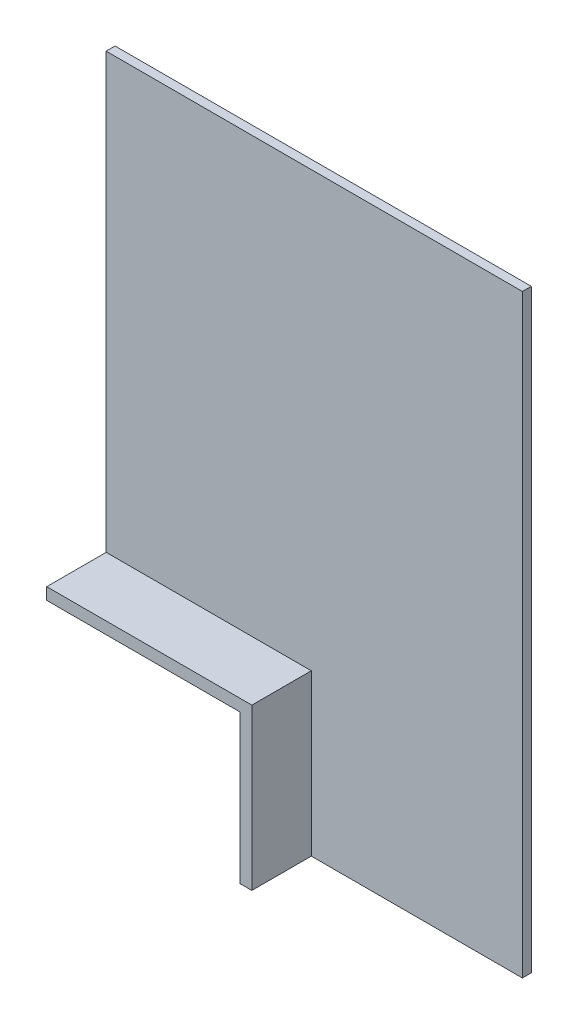
ISO-10303-21;
HEADER;
FILE_DESCRIPTION(('STEP AP214'),'2;1');
FILE_NAME('part.step','',(''),(''),'','','');
FILE_SCHEMA(('AUTOMOTIVE_DESIGN { 1 0 10303 214 1 1 1 1 }'));
ENDSEC;
DATA;
#1=APPLICATION_CONTEXT('core data for automotive mechanical design processes');
#2=APPLICATION_PROTOCOL_DEFINITION('international standard','automotive_design',2000,#1);
#3=PRODUCT_CONTEXT('',#1,'mechanical');
#4=PRODUCT('Part','Part','',(#3));
#5=PRODUCT_RELATED_PRODUCT_CATEGORY('part','',(#4));
#6=PRODUCT_DEFINITION_FORMATION('','',#4);
#7=PRODUCT_DEFINITION_CONTEXT('part definition',#1,'design');
#8=PRODUCT_DEFINITION('design','',#6,#7);
#9=PRODUCT_DEFINITION_SHAPE('','',#8);
#10=(LENGTH_UNIT() NAMED_UNIT(*) SI_UNIT(.MILLI.,.METRE.));
#11=(NAMED_UNIT(*) PLANE_ANGLE_UNIT() SI_UNIT($,.RADIAN.));
#12=(NAMED_UNIT(*) SI_UNIT($,.STERADIAN.) SOLID_ANGLE_UNIT());
#13=UNCERTAINTY_MEASURE_WITH_UNIT(LENGTH_MEASURE(1.E-05),#10,'distance_accuracy_value','');
#14=(GEOMETRIC_REPRESENTATION_CONTEXT(3) GLOBAL_UNCERTAINTY_ASSIGNED_CONTEXT((#13)) GLOBAL_UNIT_ASSIGNED_CONTEXT((#10,
#11,#12)) REPRESENTATION_CONTEXT('',''));
#15=CARTESIAN_POINT('',(0.,0.,0.));
#16=DIRECTION('',(0.,0.,1.));
#17=DIRECTION('',(1.,0.,0.));
#18=AXIS2_PLACEMENT_3D('',#15,#16,#17);
#19=CARTESIAN_POINT('',(0.,0.,3.));
#20=DIRECTION('',(0.,0.,1.));
#21=DIRECTION('',(1.,0.,0.));
#22=AXIS2_PLACEMENT_3D('',#19,#20,#21);
#23=PLANE('',#22);
#24=DIRECTION('',(-1.,0.,0.));
#25=VECTOR('',#24,1.);
#26=CARTESIAN_POINT('',(0.,-146.,3.));
#27=LINE('',#26,#25);
#28=CARTESIAN_POINT('',(69.,-146.,3.));
#29=VERTEX_POINT('',#28);
#30=CARTESIAN_POINT('',(0.,-146.,3.));
#31=VERTEX_POINT('',#30);
#32=EDGE_CURVE('E54',#29,#31,#27,.T.);
#33=ORIENTED_EDGE('',*,*,#32,.F.);
#34=DIRECTION('',(0.,-1.,0.));
#35=VECTOR('',#34,1.);
#36=CARTESIAN_POINT('',(69.,0.,3.));
#37=LINE('',#36,#35);
#38=CARTESIAN_POINT('',(69.,-200.,3.));
#39=VERTEX_POINT('',#38);
#40=EDGE_CURVE('E148',#29,#39,#37,.T.);
#41=ORIENTED_EDGE('',*,*,#40,.T.);
#42=DIRECTION('',(1.,0.,0.));
#43=VECTOR('',#42,1.);
#44=CARTESIAN_POINT('',(0.,-200.,3.));
#45=LINE('',#44,#43);
#46=CARTESIAN_POINT('',(140.,-200.,3.));
#47=VERTEX_POINT('',#46);
#48=EDGE_CURVE('E116',#39,#47,#45,.T.);
#49=ORIENTED_EDGE('',*,*,#48,.T.);
#50=DIRECTION('',(0.,1.,0.));
#51=VECTOR('',#50,1.);
#52=CARTESIAN_POINT('',(140.,0.,3.));
#53=LINE('',#52,#51);
#54=CARTESIAN_POINT('',(140.,0.,3.));
#55=VERTEX_POINT('',#54);
#56=EDGE_CURVE('E166',#47,#55,#53,.T.);
#57=ORIENTED_EDGE('',*,*,#56,.T.);
#58=DIRECTION('',(-1.,0.,0.));
#59=VECTOR('',#58,1.);
#60=CARTESIAN_POINT('',(0.,0.,3.));
#61=LINE('',#60,#59);
#62=CARTESIAN_POINT('',(0.,0.,3.));
#63=VERTEX_POINT('',#62);
#64=EDGE_CURVE('E168',#55,#63,#61,.T.);
#65=ORIENTED_EDGE('',*,*,#64,.T.);
#66=DIRECTION('',(0.,-1.,0.));
#67=VECTOR('',#66,1.);
#68=CARTESIAN_POINT('',(0.,0.,3.));
#69=LINE('',#68,#67);
#70=EDGE_CURVE('E59',#63,#31,#69,.T.);
#71=ORIENTED_EDGE('',*,*,#70,.T.);
#72=EDGE_LOOP('',(#33,#41,#49,#57,#65,#71));
#73=FACE_BOUND('',#72,.T.);
#74=ADVANCED_FACE('F39',(#73),#23,.T.);
#75=CARTESIAN_POINT('',(0.,0.,3.));
#76=DIRECTION('',(1.,0.,0.));
#77=DIRECTION('',(0.,1.,0.));
#78=AXIS2_PLACEMENT_3D('',#75,#76,#77);
#79=PLANE('',#78);
#80=DIRECTION('',(0.,-1.,0.));
#81=VECTOR('',#80,1.);
#82=CARTESIAN_POINT('',(0.,0.,0.));
#83=LINE('',#82,#81);
#84=CARTESIAN_POINT('',(0.,0.,0.));
#85=VERTEX_POINT('',#84);
#86=CARTESIAN_POINT('',(0.,-150.,0.));
#87=VERTEX_POINT('',#86);
#88=EDGE_CURVE('E158',#85,#87,#83,.T.);
#89=ORIENTED_EDGE('',*,*,#88,.T.);
#90=DIRECTION('',(0.,0.,-1.));
#91=VECTOR('',#90,1.);
#92=CARTESIAN_POINT('',(0.,-150.,10.));
#93=LINE('',#92,#91);
#94=CARTESIAN_POINT('',(0.,-150.,23.));
#95=VERTEX_POINT('',#94);
#96=EDGE_CURVE('E159',#95,#87,#93,.T.);
#97=ORIENTED_EDGE('',*,*,#96,.F.);
#98=DIRECTION('',(0.,1.,0.));
#99=VECTOR('',#98,1.);
#100=CARTESIAN_POINT('',(0.,0.,23.));
#101=LINE('',#100,#99);
#102=CARTESIAN_POINT('',(0.,-146.,23.));
#103=VERTEX_POINT('',#102);
#104=EDGE_CURVE('E140',#95,#103,#101,.T.);
#105=ORIENTED_EDGE('',*,*,#104,.T.);
#106=DIRECTION('',(0.,0.,-1.));
#107=VECTOR('',#106,1.);
#108=CARTESIAN_POINT('',(0.,-146.,23.));
#109=LINE('',#108,#107);
#110=EDGE_CURVE('E118',#103,#31,#109,.T.);
#111=ORIENTED_EDGE('',*,*,#110,.T.);
#112=ORIENTED_EDGE('',*,*,#70,.F.);
#113=DIRECTION('',(0.,0.,-1.));
#114=VECTOR('',#113,1.);
#115=CARTESIAN_POINT('',(0.,0.,3.));
#116=LINE('',#115,#114);
#117=EDGE_CURVE('E170',#63,#85,#116,.T.);
#118=ORIENTED_EDGE('',*,*,#117,.T.);
#119=EDGE_LOOP('',(#89,#97,#105,#111,#112,#118));
#120=FACE_BOUND('',#119,.T.);
#121=ADVANCED_FACE('F41',(#120),#79,.F.);
#122=CARTESIAN_POINT('',(0.,-200.,3.));
#123=DIRECTION('',(0.,1.,0.));
#124=DIRECTION('',(0.,0.,1.));
#125=AXIS2_PLACEMENT_3D('',#122,#123,#124);
#126=PLANE('',#125);
#127=DIRECTION('',(1.,0.,0.));
#128=VECTOR('',#127,1.);
#129=CARTESIAN_POINT('',(0.,-200.,0.));
#130=LINE('',#129,#128);
#131=CARTESIAN_POINT('',(65.,-200.,0.));
#132=VERTEX_POINT('',#131);
#133=CARTESIAN_POINT('',(140.,-200.,0.));
#134=VERTEX_POINT('',#133);
#135=EDGE_CURVE('E172',#132,#134,#130,.T.);
#136=ORIENTED_EDGE('',*,*,#135,.T.);
#137=DIRECTION('',(0.,0.,-1.));
#138=VECTOR('',#137,1.);
#139=CARTESIAN_POINT('',(140.,-200.,3.));
#140=LINE('',#139,#138);
#141=EDGE_CURVE('E11',#47,#134,#140,.T.);
#142=ORIENTED_EDGE('',*,*,#141,.F.);
#143=ORIENTED_EDGE('',*,*,#48,.F.);
#144=DIRECTION('',(0.,0.,-1.));
#145=VECTOR('',#144,1.);
#146=CARTESIAN_POINT('',(69.,-200.,23.));
#147=LINE('',#146,#145);
#148=CARTESIAN_POINT('',(69.,-200.,23.));
#149=VERTEX_POINT('',#148);
#150=EDGE_CURVE('E109',#149,#39,#147,.T.);
#151=ORIENTED_EDGE('',*,*,#150,.F.);
#152=DIRECTION('',(-1.,0.,0.));
#153=VECTOR('',#152,1.);
#154=CARTESIAN_POINT('',(0.,-200.,23.));
#155=LINE('',#154,#153);
#156=CARTESIAN_POINT('',(65.,-200.,23.));
#157=VERTEX_POINT('',#156);
#158=EDGE_CURVE('E114',#149,#157,#155,.T.);
#159=ORIENTED_EDGE('',*,*,#158,.T.);
#160=DIRECTION('',(0.,0.,-1.));
#161=VECTOR('',#160,1.);
#162=CARTESIAN_POINT('',(65.,-200.,10.));
#163=LINE('',#162,#161);
#164=EDGE_CURVE('E155',#157,#132,#163,.T.);
#165=ORIENTED_EDGE('',*,*,#164,.T.);
#166=EDGE_LOOP('',(#136,#142,#143,#151,#159,#165));
#167=FACE_BOUND('',#166,.T.);
#168=ADVANCED_FACE('F111',(#167),#126,.F.);
#169=CARTESIAN_POINT('',(140.,0.,3.));
#170=DIRECTION('',(-1.,0.,0.));
#171=DIRECTION('',(0.,0.,1.));
#172=AXIS2_PLACEMENT_3D('',#169,#170,#171);
#173=PLANE('',#172);
#174=DIRECTION('',(0.,1.,0.));
#175=VECTOR('',#174,1.);
#176=CARTESIAN_POINT('',(140.,0.,0.));
#177=LINE('',#176,#175);
#178=CARTESIAN_POINT('',(140.,0.,0.));
#179=VERTEX_POINT('',#178);
#180=EDGE_CURVE('E174',#134,#179,#177,.T.);
#181=ORIENTED_EDGE('',*,*,#180,.T.);
#182=DIRECTION('',(0.,0.,-1.));
#183=VECTOR('',#182,1.);
#184=CARTESIAN_POINT('',(140.,0.,3.));
#185=LINE('',#184,#183);
#186=EDGE_CURVE('E47',#55,#179,#185,.T.);
#187=ORIENTED_EDGE('',*,*,#186,.F.);
#188=ORIENTED_EDGE('',*,*,#56,.F.);
#189=ORIENTED_EDGE('',*,*,#141,.T.);
#190=EDGE_LOOP('',(#181,#187,#188,#189));
#191=FACE_BOUND('',#190,.T.);
#192=ADVANCED_FACE('F222',(#191),#173,.F.);
#193=CARTESIAN_POINT('',(0.,0.,3.));
#194=DIRECTION('',(0.,-1.,0.));
#195=DIRECTION('',(0.,0.,-1.));
#196=AXIS2_PLACEMENT_3D('',#193,#194,#195);
#197=PLANE('',#196);
#198=DIRECTION('',(-1.,0.,0.));
#199=VECTOR('',#198,1.);
#200=CARTESIAN_POINT('',(0.,0.,0.));
#201=LINE('',#200,#199);
#202=EDGE_CURVE('E164',#179,#85,#201,.T.);
#203=ORIENTED_EDGE('',*,*,#202,.T.);
#204=ORIENTED_EDGE('',*,*,#117,.F.);
#205=ORIENTED_EDGE('',*,*,#64,.F.);
#206=ORIENTED_EDGE('',*,*,#186,.T.);
#207=EDGE_LOOP('',(#203,#204,#205,#206));
#208=FACE_BOUND('',#207,.T.);
#209=ADVANCED_FACE('F183',(#208),#197,.F.);
#210=CARTESIAN_POINT('',(0.,0.,0.));
#211=DIRECTION('',(0.,0.,1.));
#212=DIRECTION('',(1.,0.,0.));
#213=AXIS2_PLACEMENT_3D('',#210,#211,#212);
#214=PLANE('',#213);
#215=ORIENTED_EDGE('',*,*,#180,.F.);
#216=ORIENTED_EDGE('',*,*,#135,.F.);
#217=DIRECTION('',(0.,-1.,0.));
#218=VECTOR('',#217,1.);
#219=CARTESIAN_POINT('',(65.,-200.,0.));
#220=LINE('',#219,#218);
#221=CARTESIAN_POINT('',(65.,-150.,0.));
#222=VERTEX_POINT('',#221);
#223=EDGE_CURVE('E150',#222,#132,#220,.T.);
#224=ORIENTED_EDGE('',*,*,#223,.F.);
#225=DIRECTION('',(1.,0.,0.));
#226=VECTOR('',#225,1.);
#227=CARTESIAN_POINT('',(65.,-150.,0.));
#228=LINE('',#227,#226);
#229=EDGE_CURVE('E152',#87,#222,#228,.T.);
#230=ORIENTED_EDGE('',*,*,#229,.F.);
#231=ORIENTED_EDGE('',*,*,#88,.F.);
#232=ORIENTED_EDGE('',*,*,#202,.F.);
#233=EDGE_LOOP('',(#215,#216,#224,#230,#231,#232));
#234=FACE_BOUND('',#233,.T.);
#235=ADVANCED_FACE('F190',(#234),#214,.F.);
#236=CARTESIAN_POINT('',(65.,-200.,10.));
#237=DIRECTION('',(1.,0.,0.));
#238=DIRECTION('',(0.,0.,-1.));
#239=AXIS2_PLACEMENT_3D('',#236,#237,#238);
#240=PLANE('',#239);
#241=ORIENTED_EDGE('',*,*,#164,.F.);
#242=DIRECTION('',(0.,1.,0.));
#243=VECTOR('',#242,1.);
#244=CARTESIAN_POINT('',(65.,0.,23.));
#245=LINE('',#244,#243);
#246=CARTESIAN_POINT('',(65.,-150.,23.));
#247=VERTEX_POINT('',#246);
#248=EDGE_CURVE('E134',#157,#247,#245,.T.);
#249=ORIENTED_EDGE('',*,*,#248,.T.);
#250=DIRECTION('',(0.,0.,-1.));
#251=VECTOR('',#250,1.);
#252=CARTESIAN_POINT('',(65.,-150.,10.));
#253=LINE('',#252,#251);
#254=EDGE_CURVE('E156',#247,#222,#253,.T.);
#255=ORIENTED_EDGE('',*,*,#254,.T.);
#256=ORIENTED_EDGE('',*,*,#223,.T.);
#257=EDGE_LOOP('',(#241,#249,#255,#256));
#258=FACE_BOUND('',#257,.T.);
#259=ADVANCED_FACE('F216',(#258),#240,.F.);
#260=CARTESIAN_POINT('',(65.,-150.,10.));
#261=DIRECTION('',(0.,1.,0.));
#262=DIRECTION('',(0.,0.,1.));
#263=AXIS2_PLACEMENT_3D('',#260,#261,#262);
#264=PLANE('',#263);
#265=ORIENTED_EDGE('',*,*,#254,.F.);
#266=DIRECTION('',(1.,0.,0.));
#267=VECTOR('',#266,1.);
#268=CARTESIAN_POINT('',(0.,-150.,23.));
#269=LINE('',#268,#267);
#270=EDGE_CURVE('E136',#95,#247,#269,.T.);
#271=ORIENTED_EDGE('',*,*,#270,.F.);
#272=ORIENTED_EDGE('',*,*,#96,.T.);
#273=ORIENTED_EDGE('',*,*,#229,.T.);
#274=EDGE_LOOP('',(#265,#271,#272,#273));
#275=FACE_BOUND('',#274,.T.);
#276=ADVANCED_FACE('F197',(#275),#264,.F.);
#277=CARTESIAN_POINT('',(69.,0.,23.));
#278=DIRECTION('',(-1.,0.,0.));
#279=DIRECTION('',(0.,0.,1.));
#280=AXIS2_PLACEMENT_3D('',#277,#278,#279);
#281=PLANE('',#280);
#282=ORIENTED_EDGE('',*,*,#40,.F.);
#283=DIRECTION('',(0.,0.,-1.));
#284=VECTOR('',#283,1.);
#285=CARTESIAN_POINT('',(69.,-146.,23.));
#286=LINE('',#285,#284);
#287=CARTESIAN_POINT('',(69.,-146.,23.));
#288=VERTEX_POINT('',#287);
#289=EDGE_CURVE('E125',#288,#29,#286,.T.);
#290=ORIENTED_EDGE('',*,*,#289,.F.);
#291=DIRECTION('',(0.,1.,0.));
#292=VECTOR('',#291,1.);
#293=CARTESIAN_POINT('',(69.,0.,23.));
#294=LINE('',#293,#292);
#295=EDGE_CURVE('E122',#149,#288,#294,.T.);
#296=ORIENTED_EDGE('',*,*,#295,.F.);
#297=ORIENTED_EDGE('',*,*,#150,.T.);
#298=EDGE_LOOP('',(#282,#290,#296,#297));
#299=FACE_BOUND('',#298,.T.);
#300=ADVANCED_FACE('F123',(#299),#281,.F.);
#301=CARTESIAN_POINT('',(0.,-146.,23.));
#302=DIRECTION('',(0.,1.,0.));
#303=DIRECTION('',(0.,0.,1.));
#304=AXIS2_PLACEMENT_3D('',#301,#302,#303);
#305=PLANE('',#304);
#306=ORIENTED_EDGE('',*,*,#289,.T.);
#307=ORIENTED_EDGE('',*,*,#32,.T.);
#308=ORIENTED_EDGE('',*,*,#110,.F.);
#309=DIRECTION('',(1.,0.,0.));
#310=VECTOR('',#309,1.);
#311=CARTESIAN_POINT('',(0.,-146.,23.));
#312=LINE('',#311,#310);
#313=EDGE_CURVE('E119',#103,#288,#312,.T.);
#314=ORIENTED_EDGE('',*,*,#313,.T.);
#315=EDGE_LOOP('',(#306,#307,#308,#314));
#316=FACE_BOUND('',#315,.T.);
#317=ADVANCED_FACE('F200',(#316),#305,.T.);
#318=CARTESIAN_POINT('',(0.,0.,23.));
#319=DIRECTION('',(0.,0.,-1.));
#320=DIRECTION('',(-1.,0.,0.));
#321=AXIS2_PLACEMENT_3D('',#318,#319,#320);
#322=PLANE('',#321);
#323=ORIENTED_EDGE('',*,*,#295,.T.);
#324=ORIENTED_EDGE('',*,*,#313,.F.);
#325=ORIENTED_EDGE('',*,*,#104,.F.);
#326=ORIENTED_EDGE('',*,*,#270,.T.);
#327=ORIENTED_EDGE('',*,*,#248,.F.);
#328=ORIENTED_EDGE('',*,*,#158,.F.);
#329=EDGE_LOOP('',(#323,#324,#325,#326,#327,#328));
#330=FACE_BOUND('',#329,.T.);
#331=ADVANCED_FACE('F131',(#330),#322,.F.);
#332=CLOSED_SHELL('',(#74,#121,#168,#192,#209,#235,#259,#276,#300,#317,#331));
#333=MANIFOLD_SOLID_BREP('B2',#332);
#334=ADVANCED_BREP_SHAPE_REPRESENTATION('',(#18,#333),#14);
#335=SHAPE_DEFINITION_REPRESENTATION(#9,#334);
ENDSEC;
END-ISO-10303-21;
